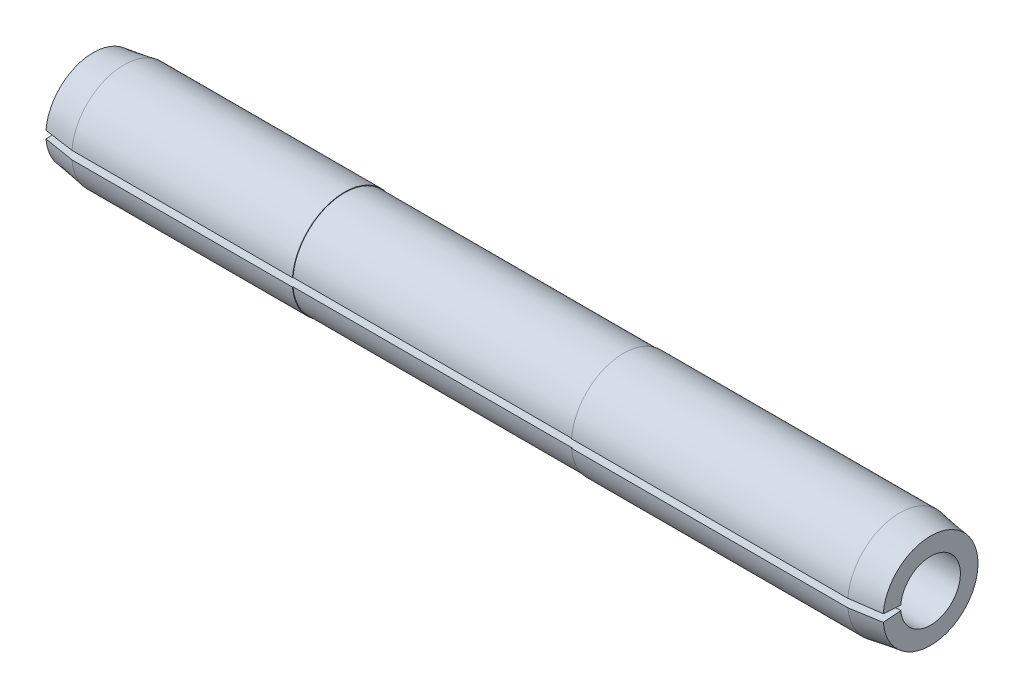
ISO-10303-21;
HEADER;
FILE_DESCRIPTION(('STEP AP214'),'2;1');
FILE_NAME('part.step','',(''),(''),'','','');
FILE_SCHEMA(('AUTOMOTIVE_DESIGN { 1 0 10303 214 1 1 1 1 }'));
ENDSEC;
DATA;
#1=APPLICATION_CONTEXT('core data for automotive mechanical design processes');
#2=APPLICATION_PROTOCOL_DEFINITION('international standard','automotive_design',2000,#1);
#3=PRODUCT_CONTEXT('',#1,'mechanical');
#4=PRODUCT('Part','Part','',(#3));
#5=PRODUCT_RELATED_PRODUCT_CATEGORY('part','',(#4));
#6=PRODUCT_DEFINITION_FORMATION('','',#4);
#7=PRODUCT_DEFINITION_CONTEXT('part definition',#1,'design');
#8=PRODUCT_DEFINITION('design','',#6,#7);
#9=PRODUCT_DEFINITION_SHAPE('','',#8);
#10=(LENGTH_UNIT() NAMED_UNIT(*) SI_UNIT(.MILLI.,.METRE.));
#11=(NAMED_UNIT(*) PLANE_ANGLE_UNIT() SI_UNIT($,.RADIAN.));
#12=(NAMED_UNIT(*) SI_UNIT($,.STERADIAN.) SOLID_ANGLE_UNIT());
#13=UNCERTAINTY_MEASURE_WITH_UNIT(LENGTH_MEASURE(1.E-05),#10,'distance_accuracy_value','');
#14=(GEOMETRIC_REPRESENTATION_CONTEXT(3) GLOBAL_UNCERTAINTY_ASSIGNED_CONTEXT((#13)) GLOBAL_UNIT_ASSIGNED_CONTEXT((#10,
#11,#12)) REPRESENTATION_CONTEXT('',''));
#15=CARTESIAN_POINT('',(0.,0.,0.));
#16=DIRECTION('',(0.,0.,1.));
#17=DIRECTION('',(1.,0.,0.));
#18=AXIS2_PLACEMENT_3D('',#15,#16,#17);
#19=CARTESIAN_POINT('',(-9.52499999999999,0.,0.));
#20=DIRECTION('',(-1.,0.,0.));
#21=DIRECTION('',(0.,0.,1.));
#22=AXIS2_PLACEMENT_3D('',#19,#20,#21);
#23=CYLINDRICAL_SURFACE('',#22,2.3749);
#24=CARTESIAN_POINT('',(11.43,0.,0.));
#25=DIRECTION('',(1.,0.,0.));
#26=DIRECTION('',(0.,0.,-1.));
#27=AXIS2_PLACEMENT_3D('',#24,#25,#26);
#28=CIRCLE('',#27,2.3749);
#29=CARTESIAN_POINT('',(11.43,-0.186332506444061,2.36757897588281));
#30=VERTEX_POINT('',#29);
#31=CARTESIAN_POINT('',(11.43,0.186332506444061,2.36757897588281));
#32=VERTEX_POINT('',#31);
#33=EDGE_CURVE('E56',#30,#32,#28,.T.);
#34=ORIENTED_EDGE('',*,*,#33,.F.);
#35=DIRECTION('',(-1.,0.,0.));
#36=VECTOR('',#35,1.);
#37=CARTESIAN_POINT('',(-9.52499999999999,-0.186332506444061,2.36757897588281));
#38=LINE('',#37,#36);
#39=CARTESIAN_POINT('',(1.397,-0.186332506444061,2.36757897588281));
#40=VERTEX_POINT('',#39);
#41=EDGE_CURVE('E172',#30,#40,#38,.T.);
#42=ORIENTED_EDGE('',*,*,#41,.T.);
#43=CARTESIAN_POINT('',(1.397,0.,0.));
#44=DIRECTION('',(-1.,0.,0.));
#45=DIRECTION('',(0.,0.,1.));
#46=AXIS2_PLACEMENT_3D('',#43,#44,#45);
#47=CIRCLE('',#46,2.3749);
#48=CARTESIAN_POINT('',(1.397,0.186332506444061,2.36757897588281));
#49=VERTEX_POINT('',#48);
#50=EDGE_CURVE('E151',#49,#40,#47,.T.);
#51=ORIENTED_EDGE('',*,*,#50,.F.);
#52=DIRECTION('',(-1.,0.,0.));
#53=VECTOR('',#52,1.);
#54=CARTESIAN_POINT('',(-9.52499999999999,0.186332506444061,2.36757897588281));
#55=LINE('',#54,#53);
#56=EDGE_CURVE('E63',#32,#49,#55,.T.);
#57=ORIENTED_EDGE('',*,*,#56,.F.);
#58=EDGE_LOOP('',(#34,#42,#51,#57));
#59=FACE_BOUND('',#58,.T.);
#60=ADVANCED_FACE('F41',(#59),#23,.T.);
#61=CARTESIAN_POINT('',(0.,2.159,0.));
#62=DIRECTION('',(1.,0.,0.));
#63=DIRECTION('',(0.,0.,-1.));
#64=AXIS2_PLACEMENT_3D('',#61,#62,#63);
#65=PLANE('',#64);
#66=DIRECTION('',(0.,0.0784590957278456,0.996917333733128));
#67=VECTOR('',#66,1.);
#68=CARTESIAN_POINT('',(0.,0.,0.));
#69=LINE('',#68,#67);
#70=CARTESIAN_POINT('',(0.,0.106618065184569,1.35471096480995));
#71=VERTEX_POINT('',#70);
#72=CARTESIAN_POINT('',(0.,0.169393187676419,2.15234452352982));
#73=VERTEX_POINT('',#72);
#74=EDGE_CURVE('E176',#71,#73,#69,.T.);
#75=ORIENTED_EDGE('',*,*,#74,.T.);
#76=CARTESIAN_POINT('',(0.,0.,0.));
#77=DIRECTION('',(-1.,0.,0.));
#78=DIRECTION('',(0.,0.,1.));
#79=AXIS2_PLACEMENT_3D('',#76,#77,#78);
#80=CIRCLE('',#79,2.159);
#81=CARTESIAN_POINT('',(0.,-0.169393187676419,2.15234452352982));
#82=VERTEX_POINT('',#81);
#83=EDGE_CURVE('E154',#73,#82,#80,.T.);
#84=ORIENTED_EDGE('',*,*,#83,.T.);
#85=DIRECTION('',(0.,-0.0784590957278456,0.996917333733128));
#86=VECTOR('',#85,1.);
#87=CARTESIAN_POINT('',(0.,0.,0.));
#88=LINE('',#87,#86);
#89=CARTESIAN_POINT('',(0.,-0.106618065184569,1.35471096480995));
#90=VERTEX_POINT('',#89);
#91=EDGE_CURVE('E173',#90,#82,#88,.T.);
#92=ORIENTED_EDGE('',*,*,#91,.F.);
#93=CARTESIAN_POINT('',(0.,0.,0.));
#94=DIRECTION('',(-1.,0.,0.));
#95=DIRECTION('',(0.,0.,1.));
#96=AXIS2_PLACEMENT_3D('',#93,#94,#95);
#97=CIRCLE('',#96,1.3589);
#98=EDGE_CURVE('E139',#71,#90,#97,.T.);
#99=ORIENTED_EDGE('',*,*,#98,.F.);
#100=EDGE_LOOP('',(#75,#84,#92,#99));
#101=FACE_BOUND('',#100,.T.);
#102=ADVANCED_FACE('F43',(#101),#65,.F.);
#103=CARTESIAN_POINT('',(-9.52499999999999,0.,0.));
#104=DIRECTION('',(-1.,0.,0.));
#105=DIRECTION('',(0.,0.,1.));
#106=AXIS2_PLACEMENT_3D('',#103,#104,#105);
#107=CYLINDRICAL_SURFACE('',#106,1.3589);
#108=DIRECTION('',(-1.,0.,0.));
#109=VECTOR('',#108,1.);
#110=CARTESIAN_POINT('',(-9.52499999999999,0.106618065184569,1.35471096480995));
#111=LINE('',#110,#109);
#112=CARTESIAN_POINT('',(38.1,0.106618065184569,1.35471096480995));
#113=VERTEX_POINT('',#112);
#114=EDGE_CURVE('E157',#71,#113,#111,.F.);
#115=ORIENTED_EDGE('',*,*,#114,.F.);
#116=ORIENTED_EDGE('',*,*,#98,.T.);
#117=DIRECTION('',(-1.,0.,0.));
#118=VECTOR('',#117,1.);
#119=CARTESIAN_POINT('',(-9.52499999999999,-0.106618065184569,1.35471096480995));
#120=LINE('',#119,#118);
#121=CARTESIAN_POINT('',(38.1,-0.106618065184569,1.35471096480995));
#122=VERTEX_POINT('',#121);
#123=EDGE_CURVE('E163',#90,#122,#120,.F.);
#124=ORIENTED_EDGE('',*,*,#123,.T.);
#125=CARTESIAN_POINT('',(38.1,0.,0.));
#126=DIRECTION('',(-1.,0.,0.));
#127=DIRECTION('',(0.,0.,1.));
#128=AXIS2_PLACEMENT_3D('',#125,#126,#127);
#129=CIRCLE('',#128,1.3589);
#130=EDGE_CURVE('E142',#113,#122,#129,.T.);
#131=ORIENTED_EDGE('',*,*,#130,.F.);
#132=EDGE_LOOP('',(#115,#116,#124,#131));
#133=FACE_BOUND('',#132,.T.);
#134=ADVANCED_FACE('F209',(#133),#107,.F.);
#135=CARTESIAN_POINT('',(38.1,1.3589,0.));
#136=DIRECTION('',(-1.,0.,0.));
#137=DIRECTION('',(0.,0.,1.));
#138=AXIS2_PLACEMENT_3D('',#135,#136,#137);
#139=PLANE('',#138);
#140=DIRECTION('',(0.,0.0784590957278456,0.996917333733128));
#141=VECTOR('',#140,1.);
#142=CARTESIAN_POINT('',(38.1,0.,0.));
#143=LINE('',#142,#141);
#144=CARTESIAN_POINT('',(38.1,0.169393187676419,2.15234452352982));
#145=VERTEX_POINT('',#144);
#146=EDGE_CURVE('E175',#113,#145,#143,.T.);
#147=ORIENTED_EDGE('',*,*,#146,.F.);
#148=ORIENTED_EDGE('',*,*,#130,.T.);
#149=DIRECTION('',(0.,-0.0784590957278456,0.996917333733128));
#150=VECTOR('',#149,1.);
#151=CARTESIAN_POINT('',(38.1,0.,0.));
#152=LINE('',#151,#150);
#153=CARTESIAN_POINT('',(38.1,-0.169393187676419,2.15234452352982));
#154=VERTEX_POINT('',#153);
#155=EDGE_CURVE('E180',#122,#154,#152,.T.);
#156=ORIENTED_EDGE('',*,*,#155,.T.);
#157=CARTESIAN_POINT('',(38.1,0.,0.));
#158=DIRECTION('',(-1.,0.,0.));
#159=DIRECTION('',(0.,0.,1.));
#160=AXIS2_PLACEMENT_3D('',#157,#158,#159);
#161=CIRCLE('',#160,2.159);
#162=EDGE_CURVE('E145',#145,#154,#161,.T.);
#163=ORIENTED_EDGE('',*,*,#162,.F.);
#164=EDGE_LOOP('',(#147,#148,#156,#163));
#165=FACE_BOUND('',#164,.T.);
#166=ADVANCED_FACE('F215',(#165),#139,.F.);
#167=CARTESIAN_POINT('',(38.1,0.,0.));
#168=DIRECTION('',(-1.,0.,0.));
#169=DIRECTION('',(0.,0.,1.));
#170=AXIS2_PLACEMENT_3D('',#167,#168,#169);
#171=CONICAL_SURFACE('',#170,2.159,0.153332388398326);
#172=DIRECTION('',(-0.988267602905191,0.011983235471256,0.152261443299569));
#173=VECTOR('',#172,1.);
#174=CARTESIAN_POINT('',(52.0699999999997,0.,0.));
#175=LINE('',#174,#173);
#176=CARTESIAN_POINT('',(36.703,0.186332506444061,2.36757897588281));
#177=VERTEX_POINT('',#176);
#178=EDGE_CURVE('E159',#145,#177,#175,.T.);
#179=ORIENTED_EDGE('',*,*,#178,.F.);
#180=ORIENTED_EDGE('',*,*,#162,.T.);
#181=DIRECTION('',(-0.988267602905191,-0.011983235471256,0.152261443299569));
#182=VECTOR('',#181,1.);
#183=CARTESIAN_POINT('',(52.0699999999997,0.,0.));
#184=LINE('',#183,#182);
#185=CARTESIAN_POINT('',(36.703,-0.186332506444061,2.36757897588281));
#186=VERTEX_POINT('',#185);
#187=EDGE_CURVE('E166',#154,#186,#184,.T.);
#188=ORIENTED_EDGE('',*,*,#187,.T.);
#189=CARTESIAN_POINT('',(36.703,0.,0.));
#190=DIRECTION('',(-1.,0.,0.));
#191=DIRECTION('',(0.,0.,1.));
#192=AXIS2_PLACEMENT_3D('',#189,#190,#191);
#193=CIRCLE('',#192,2.3749);
#194=EDGE_CURVE('E148',#177,#186,#193,.T.);
#195=ORIENTED_EDGE('',*,*,#194,.F.);
#196=EDGE_LOOP('',(#179,#180,#188,#195));
#197=FACE_BOUND('',#196,.T.);
#198=ADVANCED_FACE('F217',(#197),#171,.T.);
#199=CARTESIAN_POINT('',(24.13,-0.186332506444061,2.36757897588281));
#200=VERTEX_POINT('',#199);
#201=EDGE_CURVE('E169',#186,#200,#38,.T.);
#202=ORIENTED_EDGE('',*,*,#201,.T.);
#203=CARTESIAN_POINT('',(24.13,0.,0.));
#204=DIRECTION('',(1.,0.,0.));
#205=DIRECTION('',(0.,0.,-1.));
#206=AXIS2_PLACEMENT_3D('',#203,#204,#205);
#207=CIRCLE('',#206,2.3749);
#208=CARTESIAN_POINT('',(24.13,0.186332506444061,2.36757897588281));
#209=VERTEX_POINT('',#208);
#210=EDGE_CURVE('E186',#200,#209,#207,.T.);
#211=ORIENTED_EDGE('',*,*,#210,.T.);
#212=EDGE_CURVE('E161',#177,#209,#55,.T.);
#213=ORIENTED_EDGE('',*,*,#212,.F.);
#214=ORIENTED_EDGE('',*,*,#194,.T.);
#215=EDGE_LOOP('',(#202,#211,#213,#214));
#216=FACE_BOUND('',#215,.T.);
#217=ADVANCED_FACE('F221',(#216),#23,.T.);
#218=CARTESIAN_POINT('',(1.397,0.,0.));
#219=DIRECTION('',(1.,0.,0.));
#220=DIRECTION('',(0.,0.,-1.));
#221=AXIS2_PLACEMENT_3D('',#218,#219,#220);
#222=CONICAL_SURFACE('',#221,2.3749,0.153332388398323);
#223=DIRECTION('',(-0.988267602905192,-0.0119832354712558,-0.152261443299566));
#224=VECTOR('',#223,1.);
#225=CARTESIAN_POINT('',(-13.97,0.,0.));
#226=LINE('',#225,#224);
#227=EDGE_CURVE('E121',#49,#73,#226,.T.);
#228=ORIENTED_EDGE('',*,*,#227,.F.);
#229=ORIENTED_EDGE('',*,*,#50,.T.);
#230=DIRECTION('',(-0.988267602905192,0.0119832354712558,-0.152261443299566));
#231=VECTOR('',#230,1.);
#232=CARTESIAN_POINT('',(-13.97,0.,0.));
#233=LINE('',#232,#231);
#234=EDGE_CURVE('E136',#40,#82,#233,.T.);
#235=ORIENTED_EDGE('',*,*,#234,.T.);
#236=ORIENTED_EDGE('',*,*,#83,.F.);
#237=EDGE_LOOP('',(#228,#229,#235,#236));
#238=FACE_BOUND('',#237,.T.);
#239=ADVANCED_FACE('F202',(#238),#222,.T.);
#240=CARTESIAN_POINT('',(38.1,0.,0.));
#241=DIRECTION('',(0.,-0.996917333733128,-0.0784590957278456));
#242=DIRECTION('',(0.,0.0784590957278456,-0.996917333733128));
#243=AXIS2_PLACEMENT_3D('',#240,#241,#242);
#244=PLANE('',#243);
#245=DIRECTION('',(-1.,0.,0.));
#246=VECTOR('',#245,1.);
#247=CARTESIAN_POINT('',(24.13,-0.184339645412573,2.34225727560598));
#248=LINE('',#247,#246);
#249=CARTESIAN_POINT('',(11.43,-0.184339645412573,2.34225727560598));
#250=VERTEX_POINT('',#249);
#251=CARTESIAN_POINT('',(24.13,-0.184339645412573,2.34225727560598));
#252=VERTEX_POINT('',#251);
#253=EDGE_CURVE('E128',#250,#252,#248,.F.);
#254=ORIENTED_EDGE('',*,*,#253,.T.);
#255=DIRECTION('',(0.,-0.0784590957278456,0.996917333733128));
#256=VECTOR('',#255,1.);
#257=CARTESIAN_POINT('',(24.13,0.,0.));
#258=LINE('',#257,#256);
#259=EDGE_CURVE('E179',#252,#200,#258,.T.);
#260=ORIENTED_EDGE('',*,*,#259,.T.);
#261=ORIENTED_EDGE('',*,*,#201,.F.);
#262=ORIENTED_EDGE('',*,*,#187,.F.);
#263=ORIENTED_EDGE('',*,*,#155,.F.);
#264=ORIENTED_EDGE('',*,*,#123,.F.);
#265=ORIENTED_EDGE('',*,*,#91,.T.);
#266=ORIENTED_EDGE('',*,*,#234,.F.);
#267=ORIENTED_EDGE('',*,*,#41,.F.);
#268=DIRECTION('',(0.,-0.0784590957278456,0.996917333733128));
#269=VECTOR('',#268,1.);
#270=CARTESIAN_POINT('',(11.43,0.,0.));
#271=LINE('',#270,#269);
#272=EDGE_CURVE('E190',#250,#30,#271,.T.);
#273=ORIENTED_EDGE('',*,*,#272,.F.);
#274=EDGE_LOOP('',(#254,#260,#261,#262,#263,#264,#265,#266,#267,#273));
#275=FACE_BOUND('',#274,.T.);
#276=ADVANCED_FACE('F196',(#275),#244,.F.);
#277=CARTESIAN_POINT('',(38.1,0.,0.));
#278=DIRECTION('',(0.,-0.996917333733128,0.0784590957278456));
#279=DIRECTION('',(0.,-0.0784590957278456,-0.996917333733128));
#280=AXIS2_PLACEMENT_3D('',#277,#278,#279);
#281=PLANE('',#280);
#282=DIRECTION('',(0.,0.0784590957278456,0.996917333733128));
#283=VECTOR('',#282,1.);
#284=CARTESIAN_POINT('',(24.13,0.,0.));
#285=LINE('',#284,#283);
#286=CARTESIAN_POINT('',(24.13,0.184339645412573,2.34225727560598));
#287=VERTEX_POINT('',#286);
#288=EDGE_CURVE('E11',#287,#209,#285,.T.);
#289=ORIENTED_EDGE('',*,*,#288,.F.);
#290=DIRECTION('',(-1.,0.,0.));
#291=VECTOR('',#290,1.);
#292=CARTESIAN_POINT('',(24.13,0.184339645412573,2.34225727560598));
#293=LINE('',#292,#291);
#294=CARTESIAN_POINT('',(11.43,0.184339645412573,2.34225727560598));
#295=VERTEX_POINT('',#294);
#296=EDGE_CURVE('E49',#295,#287,#293,.F.);
#297=ORIENTED_EDGE('',*,*,#296,.F.);
#298=DIRECTION('',(0.,0.0784590957278456,0.996917333733128));
#299=VECTOR('',#298,1.);
#300=CARTESIAN_POINT('',(11.43,0.,0.));
#301=LINE('',#300,#299);
#302=EDGE_CURVE('E115',#295,#32,#301,.T.);
#303=ORIENTED_EDGE('',*,*,#302,.T.);
#304=ORIENTED_EDGE('',*,*,#56,.T.);
#305=ORIENTED_EDGE('',*,*,#227,.T.);
#306=ORIENTED_EDGE('',*,*,#74,.F.);
#307=ORIENTED_EDGE('',*,*,#114,.T.);
#308=ORIENTED_EDGE('',*,*,#146,.T.);
#309=ORIENTED_EDGE('',*,*,#178,.T.);
#310=ORIENTED_EDGE('',*,*,#212,.T.);
#311=EDGE_LOOP('',(#289,#297,#303,#304,#305,#306,#307,#308,#309,#310));
#312=FACE_BOUND('',#311,.T.);
#313=ADVANCED_FACE('F132',(#312),#281,.T.);
#314=CARTESIAN_POINT('',(24.13,0.,0.));
#315=DIRECTION('',(1.,0.,0.));
#316=DIRECTION('',(0.,0.,-1.));
#317=AXIS2_PLACEMENT_3D('',#314,#315,#316);
#318=PLANE('',#317);
#319=CARTESIAN_POINT('',(24.13,0.,0.));
#320=DIRECTION('',(1.,0.,0.));
#321=DIRECTION('',(0.,0.,-1.));
#322=AXIS2_PLACEMENT_3D('',#319,#320,#321);
#323=CIRCLE('',#322,2.3495);
#324=EDGE_CURVE('E129',#252,#287,#323,.T.);
#325=ORIENTED_EDGE('',*,*,#324,.T.);
#326=ORIENTED_EDGE('',*,*,#288,.T.);
#327=ORIENTED_EDGE('',*,*,#210,.F.);
#328=ORIENTED_EDGE('',*,*,#259,.F.);
#329=EDGE_LOOP('',(#325,#326,#327,#328));
#330=FACE_BOUND('',#329,.T.);
#331=ADVANCED_FACE('F194',(#330),#318,.F.);
#332=CARTESIAN_POINT('',(24.13,0.,0.));
#333=DIRECTION('',(-1.,0.,0.));
#334=DIRECTION('',(0.,0.,1.));
#335=AXIS2_PLACEMENT_3D('',#332,#333,#334);
#336=CYLINDRICAL_SURFACE('',#335,2.3495);
#337=CARTESIAN_POINT('',(11.43,0.,0.));
#338=DIRECTION('',(1.,0.,0.));
#339=DIRECTION('',(0.,0.,-1.));
#340=AXIS2_PLACEMENT_3D('',#337,#338,#339);
#341=CIRCLE('',#340,2.3495);
#342=EDGE_CURVE('E118',#250,#295,#341,.T.);
#343=ORIENTED_EDGE('',*,*,#342,.T.);
#344=ORIENTED_EDGE('',*,*,#296,.T.);
#345=ORIENTED_EDGE('',*,*,#324,.F.);
#346=ORIENTED_EDGE('',*,*,#253,.F.);
#347=EDGE_LOOP('',(#343,#344,#345,#346));
#348=FACE_BOUND('',#347,.T.);
#349=ADVANCED_FACE('F124',(#348),#336,.T.);
#350=CARTESIAN_POINT('',(11.43,0.,0.));
#351=DIRECTION('',(1.,0.,0.));
#352=DIRECTION('',(0.,0.,-1.));
#353=AXIS2_PLACEMENT_3D('',#350,#351,#352);
#354=PLANE('',#353);
#355=ORIENTED_EDGE('',*,*,#272,.T.);
#356=ORIENTED_EDGE('',*,*,#33,.T.);
#357=ORIENTED_EDGE('',*,*,#302,.F.);
#358=ORIENTED_EDGE('',*,*,#342,.F.);
#359=EDGE_LOOP('',(#355,#356,#357,#358));
#360=FACE_BOUND('',#359,.T.);
#361=ADVANCED_FACE('F117',(#360),#354,.T.);
#362=CLOSED_SHELL('',(#60,#102,#134,#166,#198,#217,#239,#276,#313,#331,#349,#361));
#363=MANIFOLD_SOLID_BREP('B2',#362);
#364=ADVANCED_BREP_SHAPE_REPRESENTATION('',(#18,#363),#14);
#365=SHAPE_DEFINITION_REPRESENTATION(#9,#364);
ENDSEC;
END-ISO-10303-21;
